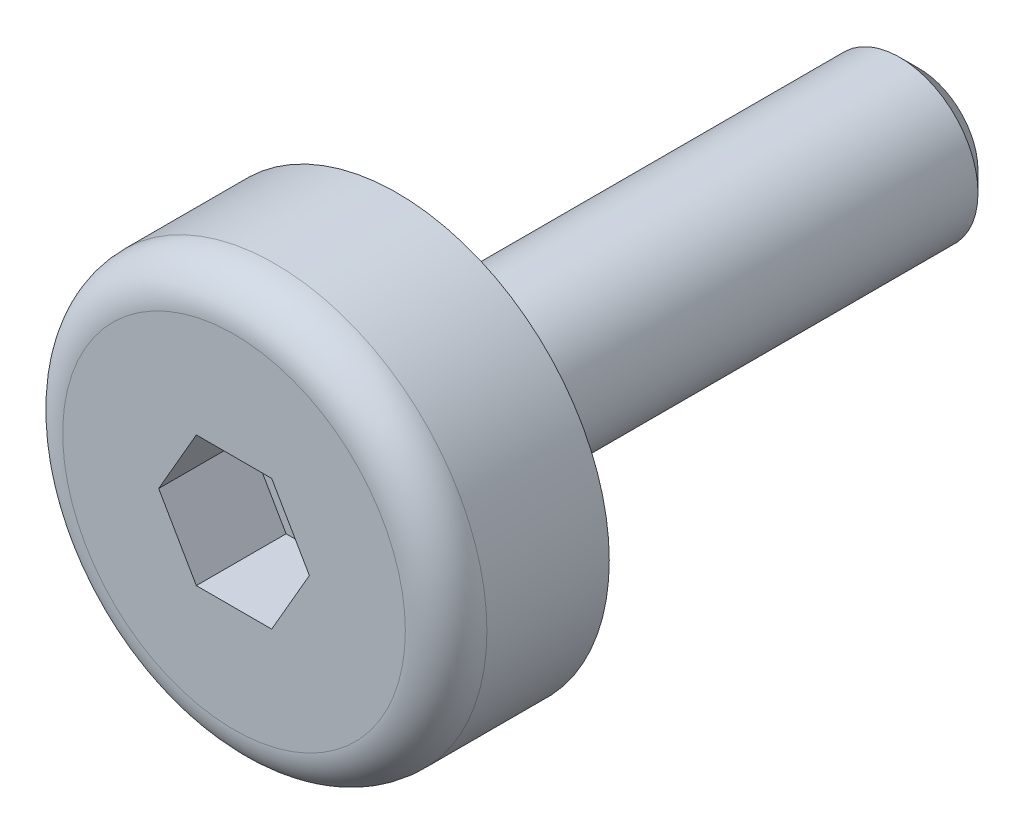
ISO-10303-21;
HEADER;
FILE_DESCRIPTION(('STEP AP214'),'2;1');
FILE_NAME('part.step','',(''),(''),'','','');
FILE_SCHEMA(('AUTOMOTIVE_DESIGN { 1 0 10303 214 1 1 1 1 }'));
ENDSEC;
DATA;
#1=APPLICATION_CONTEXT('core data for automotive mechanical design processes');
#2=APPLICATION_PROTOCOL_DEFINITION('international standard','automotive_design',2000,#1);
#3=PRODUCT_CONTEXT('',#1,'mechanical');
#4=PRODUCT('Part','Part','',(#3));
#5=PRODUCT_RELATED_PRODUCT_CATEGORY('part','',(#4));
#6=PRODUCT_DEFINITION_FORMATION('','',#4);
#7=PRODUCT_DEFINITION_CONTEXT('part definition',#1,'design');
#8=PRODUCT_DEFINITION('design','',#6,#7);
#9=PRODUCT_DEFINITION_SHAPE('','',#8);
#10=(LENGTH_UNIT() NAMED_UNIT(*) SI_UNIT(.MILLI.,.METRE.));
#11=(NAMED_UNIT(*) PLANE_ANGLE_UNIT() SI_UNIT($,.RADIAN.));
#12=(NAMED_UNIT(*) SI_UNIT($,.STERADIAN.) SOLID_ANGLE_UNIT());
#13=UNCERTAINTY_MEASURE_WITH_UNIT(LENGTH_MEASURE(1.E-05),#10,'distance_accuracy_value','');
#14=(GEOMETRIC_REPRESENTATION_CONTEXT(3) GLOBAL_UNCERTAINTY_ASSIGNED_CONTEXT((#13)) GLOBAL_UNIT_ASSIGNED_CONTEXT((#10,
#11,#12)) REPRESENTATION_CONTEXT('',''));
#15=CARTESIAN_POINT('',(0.,0.,0.));
#16=DIRECTION('',(0.,0.,1.));
#17=DIRECTION('',(1.,0.,0.));
#18=AXIS2_PLACEMENT_3D('',#15,#16,#17);
#19=CARTESIAN_POINT('',(0.,0.,-8.));
#20=DIRECTION('',(0.,0.,-1.));
#21=DIRECTION('',(-1.,0.,0.));
#22=AXIS2_PLACEMENT_3D('',#19,#20,#21);
#23=PLANE('',#22);
#24=CARTESIAN_POINT('',(0.,0.,-8.));
#25=DIRECTION('',(0.,0.,-1.));
#26=DIRECTION('',(-1.,0.,0.));
#27=AXIS2_PLACEMENT_3D('',#24,#25,#26);
#28=CIRCLE('',#27,0.899999999999995);
#29=CARTESIAN_POINT('',(0.899999999999995,0.,-8.));
#30=VERTEX_POINT('',#29);
#31=EDGE_CURVE('E156',#30,#30,#28,.T.);
#32=ORIENTED_EDGE('',*,*,#31,.T.);
#33=EDGE_LOOP('',(#32));
#34=FACE_BOUND('',#33,.T.);
#35=ADVANCED_FACE('F40',(#34),#23,.T.);
#36=CARTESIAN_POINT('',(0.,0.,10.123));
#37=DIRECTION('',(0.,0.,1.));
#38=DIRECTION('',(1.,0.,0.));
#39=AXIS2_PLACEMENT_3D('',#36,#37,#38);
#40=CYLINDRICAL_SURFACE('',#39,1.2);
#41=CARTESIAN_POINT('',(0.,0.,-7.69999999999999));
#42=DIRECTION('',(0.,0.,-1.));
#43=DIRECTION('',(-1.,0.,0.));
#44=AXIS2_PLACEMENT_3D('',#41,#42,#43);
#45=CIRCLE('',#44,1.2);
#46=CARTESIAN_POINT('',(1.2,0.,-7.69999999999999));
#47=VERTEX_POINT('',#46);
#48=EDGE_CURVE('E153',#47,#47,#45,.F.);
#49=ORIENTED_EDGE('',*,*,#48,.T.);
#50=EDGE_LOOP('',(#49));
#51=FACE_BOUND('',#50,.T.);
#52=CARTESIAN_POINT('',(0.,0.,0.));
#53=DIRECTION('',(0.,0.,1.));
#54=DIRECTION('',(1.,0.,0.));
#55=AXIS2_PLACEMENT_3D('',#52,#53,#54);
#56=CIRCLE('',#55,1.2);
#57=CARTESIAN_POINT('',(1.2,0.,0.));
#58=VERTEX_POINT('',#57);
#59=EDGE_CURVE('E150',#58,#58,#56,.T.);
#60=ORIENTED_EDGE('',*,*,#59,.F.);
#61=EDGE_LOOP('',(#60));
#62=FACE_BOUND('',#61,.T.);
#63=ADVANCED_FACE('F176',(#51,#62),#40,.T.);
#64=CARTESIAN_POINT('',(1.2,0.,0.));
#65=DIRECTION('',(0.,0.,-1.));
#66=DIRECTION('',(-1.,0.,0.));
#67=AXIS2_PLACEMENT_3D('',#64,#65,#66);
#68=PLANE('',#67);
#69=ORIENTED_EDGE('',*,*,#59,.T.);
#70=EDGE_LOOP('',(#69));
#71=FACE_BOUND('',#70,.T.);
#72=CARTESIAN_POINT('',(0.,0.,0.));
#73=DIRECTION('',(0.,0.,1.));
#74=DIRECTION('',(1.,0.,0.));
#75=AXIS2_PLACEMENT_3D('',#72,#73,#74);
#76=CIRCLE('',#75,3.25);
#77=CARTESIAN_POINT('',(3.25,0.,0.));
#78=VERTEX_POINT('',#77);
#79=EDGE_CURVE('E142',#78,#78,#76,.T.);
#80=ORIENTED_EDGE('',*,*,#79,.F.);
#81=EDGE_LOOP('',(#80));
#82=FACE_BOUND('',#81,.T.);
#83=ADVANCED_FACE('F182',(#71,#82),#68,.T.);
#84=CARTESIAN_POINT('',(0.,0.,10.123));
#85=DIRECTION('',(0.,0.,1.));
#86=DIRECTION('',(1.,0.,0.));
#87=AXIS2_PLACEMENT_3D('',#84,#85,#86);
#88=CYLINDRICAL_SURFACE('',#87,3.25);
#89=CARTESIAN_POINT('',(0.,0.,1.875));
#90=DIRECTION('',(0.,0.,1.));
#91=DIRECTION('',(1.,0.,0.));
#92=AXIS2_PLACEMENT_3D('',#89,#90,#91);
#93=CIRCLE('',#92,3.25);
#94=CARTESIAN_POINT('',(3.25,0.,1.875));
#95=VERTEX_POINT('',#94);
#96=EDGE_CURVE('E11',#95,#95,#93,.F.);
#97=ORIENTED_EDGE('',*,*,#96,.T.);
#98=EDGE_LOOP('',(#97));
#99=FACE_BOUND('',#98,.T.);
#100=ORIENTED_EDGE('',*,*,#79,.T.);
#101=EDGE_LOOP('',(#100));
#102=FACE_BOUND('',#101,.T.);
#103=ADVANCED_FACE('F191',(#99,#102),#88,.T.);
#104=CARTESIAN_POINT('',(3.25,0.,2.5));
#105=DIRECTION('',(0.,0.,1.));
#106=DIRECTION('',(1.,0.,0.));
#107=AXIS2_PLACEMENT_3D('',#104,#105,#106);
#108=PLANE('',#107);
#109=DIRECTION('',(0.499999999999995,0.866025403784441,0.));
#110=VECTOR('',#109,1.);
#111=CARTESIAN_POINT('',(0.577350269189637,-0.999999999999993,2.5));
#112=LINE('',#111,#110);
#113=CARTESIAN_POINT('',(0.577350269189637,-0.999999999999993,2.5));
#114=VERTEX_POINT('',#113);
#115=CARTESIAN_POINT('',(1.15470053837925,0.,2.5));
#116=VERTEX_POINT('',#115);
#117=EDGE_CURVE('E55',#114,#116,#112,.T.);
#118=ORIENTED_EDGE('',*,*,#117,.F.);
#119=DIRECTION('',(1.,0.,0.));
#120=VECTOR('',#119,1.);
#121=CARTESIAN_POINT('',(-0.577350269189617,-1.00000000000001,2.5));
#122=LINE('',#121,#120);
#123=CARTESIAN_POINT('',(-0.577350269189617,-1.00000000000001,2.5));
#124=VERTEX_POINT('',#123);
#125=EDGE_CURVE('E138',#124,#114,#122,.T.);
#126=ORIENTED_EDGE('',*,*,#125,.F.);
#127=DIRECTION('',(0.500000000000007,-0.866025403784434,0.));
#128=VECTOR('',#127,1.);
#129=CARTESIAN_POINT('',(-1.15470053837925,0.,2.5));
#130=LINE('',#129,#128);
#131=CARTESIAN_POINT('',(-1.15470053837925,0.,2.5));
#132=VERTEX_POINT('',#131);
#133=EDGE_CURVE('E136',#132,#124,#130,.T.);
#134=ORIENTED_EDGE('',*,*,#133,.F.);
#135=DIRECTION('',(-0.499999999999995,-0.866025403784442,0.));
#136=VECTOR('',#135,1.);
#137=CARTESIAN_POINT('',(-0.57735026918963,0.999999999999998,2.5));
#138=LINE('',#137,#136);
#139=CARTESIAN_POINT('',(-0.57735026918963,0.999999999999998,2.5));
#140=VERTEX_POINT('',#139);
#141=EDGE_CURVE('E103',#140,#132,#138,.T.);
#142=ORIENTED_EDGE('',*,*,#141,.F.);
#143=DIRECTION('',(-1.,0.,0.));
#144=VECTOR('',#143,1.);
#145=CARTESIAN_POINT('',(0.577350269189624,1.,2.5));
#146=LINE('',#145,#144);
#147=CARTESIAN_POINT('',(0.577350269189624,1.,2.5));
#148=VERTEX_POINT('',#147);
#149=EDGE_CURVE('E132',#148,#140,#146,.T.);
#150=ORIENTED_EDGE('',*,*,#149,.F.);
#151=DIRECTION('',(-0.500000000000001,0.866025403784438,0.));
#152=VECTOR('',#151,1.);
#153=CARTESIAN_POINT('',(1.15470053837925,0.,2.5));
#154=LINE('',#153,#152);
#155=EDGE_CURVE('E129',#116,#148,#154,.T.);
#156=ORIENTED_EDGE('',*,*,#155,.F.);
#157=EDGE_LOOP('',(#118,#126,#134,#142,#150,#156));
#158=FACE_BOUND('',#157,.T.);
#159=CARTESIAN_POINT('',(0.,0.,2.5));
#160=DIRECTION('',(0.,0.,1.));
#161=DIRECTION('',(1.,0.,0.));
#162=AXIS2_PLACEMENT_3D('',#159,#160,#161);
#163=CIRCLE('',#162,2.625);
#164=CARTESIAN_POINT('',(2.625,0.,2.5));
#165=VERTEX_POINT('',#164);
#166=EDGE_CURVE('E48',#165,#165,#163,.T.);
#167=ORIENTED_EDGE('',*,*,#166,.T.);
#168=EDGE_LOOP('',(#167));
#169=FACE_BOUND('',#168,.T.);
#170=ADVANCED_FACE('F161',(#158,#169),#108,.T.);
#171=CARTESIAN_POINT('',(0.,0.,-7.69999999999999));
#172=DIRECTION('',(0.,0.,1.));
#173=DIRECTION('',(1.,0.,0.));
#174=AXIS2_PLACEMENT_3D('',#171,#172,#173);
#175=CONICAL_SURFACE('',#174,1.2,0.785398163397449);
#176=CARTESIAN_POINT('',(0.899999999999995,0.,-8.));
#177=CARTESIAN_POINT('',(0.903124999999996,0.,-7.996875));
#178=CARTESIAN_POINT('',(0.906249999999996,0.,-7.99375));
#179=CARTESIAN_POINT('',(0.912499999999996,0.,-7.9875));
#180=CARTESIAN_POINT('',(0.915624999999996,0.,-7.984375));
#181=CARTESIAN_POINT('',(0.921874999999996,0.,-7.978125));
#182=CARTESIAN_POINT('',(0.924999999999996,0.,-7.975));
#183=CARTESIAN_POINT('',(0.931249999999996,0.,-7.96875));
#184=CARTESIAN_POINT('',(0.934374999999996,0.,-7.965625));
#185=CARTESIAN_POINT('',(0.940624999999996,0.,-7.959375));
#186=CARTESIAN_POINT('',(0.943749999999996,0.,-7.95625));
#187=CARTESIAN_POINT('',(0.949999999999996,0.,-7.95));
#188=CARTESIAN_POINT('',(0.953124999999996,0.,-7.946875));
#189=CARTESIAN_POINT('',(0.959374999999996,0.,-7.940625));
#190=CARTESIAN_POINT('',(0.962499999999996,0.,-7.9375));
#191=CARTESIAN_POINT('',(0.968749999999997,0.,-7.93125));
#192=CARTESIAN_POINT('',(0.971874999999997,0.,-7.928125));
#193=CARTESIAN_POINT('',(0.978124999999997,0.,-7.921875));
#194=CARTESIAN_POINT('',(0.981249999999996,0.,-7.91875));
#195=CARTESIAN_POINT('',(0.987499999999997,0.,-7.9125));
#196=CARTESIAN_POINT('',(0.990624999999997,0.,-7.909375));
#197=CARTESIAN_POINT('',(0.996874999999997,0.,-7.903125));
#198=CARTESIAN_POINT('',(0.999999999999997,0.,-7.9));
#199=CARTESIAN_POINT('',(1.00625,0.,-7.89375));
#200=CARTESIAN_POINT('',(1.009375,0.,-7.890625));
#201=CARTESIAN_POINT('',(1.015625,0.,-7.884375));
#202=CARTESIAN_POINT('',(1.01875,0.,-7.88125));
#203=CARTESIAN_POINT('',(1.025,0.,-7.875));
#204=CARTESIAN_POINT('',(1.028125,0.,-7.871875));
#205=CARTESIAN_POINT('',(1.034375,0.,-7.865625));
#206=CARTESIAN_POINT('',(1.0375,0.,-7.8625));
#207=CARTESIAN_POINT('',(1.04375,0.,-7.85625));
#208=CARTESIAN_POINT('',(1.046875,0.,-7.853125));
#209=CARTESIAN_POINT('',(1.053125,0.,-7.846875));
#210=CARTESIAN_POINT('',(1.05625,0.,-7.84375));
#211=CARTESIAN_POINT('',(1.0625,0.,-7.8375));
#212=CARTESIAN_POINT('',(1.065625,0.,-7.834375));
#213=CARTESIAN_POINT('',(1.071875,0.,-7.828125));
#214=CARTESIAN_POINT('',(1.075,0.,-7.825));
#215=CARTESIAN_POINT('',(1.08125,0.,-7.81875));
#216=CARTESIAN_POINT('',(1.084375,0.,-7.815625));
#217=CARTESIAN_POINT('',(1.090625,0.,-7.809375));
#218=CARTESIAN_POINT('',(1.09375,0.,-7.80625));
#219=CARTESIAN_POINT('',(1.1,0.,-7.8));
#220=CARTESIAN_POINT('',(1.103125,0.,-7.796875));
#221=CARTESIAN_POINT('',(1.109375,0.,-7.790625));
#222=CARTESIAN_POINT('',(1.1125,0.,-7.7875));
#223=CARTESIAN_POINT('',(1.11875,0.,-7.78125));
#224=CARTESIAN_POINT('',(1.121875,0.,-7.778125));
#225=CARTESIAN_POINT('',(1.128125,0.,-7.771875));
#226=CARTESIAN_POINT('',(1.13125,0.,-7.76875));
#227=CARTESIAN_POINT('',(1.1375,0.,-7.7625));
#228=CARTESIAN_POINT('',(1.140625,0.,-7.759375));
#229=CARTESIAN_POINT('',(1.146875,0.,-7.753125));
#230=CARTESIAN_POINT('',(1.15,0.,-7.75));
#231=CARTESIAN_POINT('',(1.15625,0.,-7.74375));
#232=CARTESIAN_POINT('',(1.159375,0.,-7.740625));
#233=CARTESIAN_POINT('',(1.165625,0.,-7.734375));
#234=CARTESIAN_POINT('',(1.16875,0.,-7.73124999999999));
#235=CARTESIAN_POINT('',(1.175,0.,-7.725));
#236=CARTESIAN_POINT('',(1.178125,0.,-7.721875));
#237=CARTESIAN_POINT('',(1.184375,0.,-7.71562499999999));
#238=CARTESIAN_POINT('',(1.1875,0.,-7.71249999999999));
#239=CARTESIAN_POINT('',(1.19375,0.,-7.70625));
#240=CARTESIAN_POINT('',(1.196875,0.,-7.70312499999999));
#241=CARTESIAN_POINT('',(1.2,0.,-7.69999999999999));
#242=B_SPLINE_CURVE_WITH_KNOTS('',3,(#176,#177,#178,#179,#180,#181,#182,#183,#184,#185,#186,
#187,#188,#189,#190,#191,#192,#193,#194,#195,#196,#197,#198,#199,#200,#201,#202,#203,#204,#205,
#206,#207,#208,#209,#210,#211,#212,#213,#214,#215,#216,#217,#218,#219,#220,#221,#222,#223,#224,
#225,#226,#227,#228,#229,#230,#231,#232,#233,#234,#235,#236,#237,#238,#239,#240,#241),
.UNSPECIFIED.,.F.,.F.,(4,2,2,2,2,2,2,2,2,2,2,2,2,2,2,2,2,2,2,2,2,2,2,2,2,2,2,2,2,2,2,2,4),(0.,
0.0132582521472471,0.0265165042944955,0.0397747564417438,0.0530330085889911,0.0662912607362394,
0.0795495128834877,0.0928077650307349,0.106066017177983,0.119324269325232,0.132582521472479,
0.145840773619727,0.159099025766976,0.172357277914223,0.185615530061471,0.198873782208719,
0.212132034355967,0.225390286503215,0.238648538650463,0.251906790797711,0.265165042944959,
0.278423295092207,0.291681547239455,0.304939799386703,0.318198051533951,0.331456303681199,
0.344714555828447,0.357972807975695,0.371231060122943,0.384489312270191,0.397747564417439,
0.411005816564686,0.424264068711934),.UNSPECIFIED.);
#243=EDGE_CURVE('BSEAM165',#30,#47,#242,.T.);
#244=ORIENTED_EDGE('',*,*,#31,.F.);
#245=ORIENTED_EDGE('',*,*,#48,.F.);
#246=ORIENTED_EDGE('',*,*,#243,.T.);
#247=ORIENTED_EDGE('',*,*,#243,.F.);
#248=EDGE_LOOP('',(#244,#246,#245,#247));
#249=FACE_BOUND('',#248,.T.);
#250=ADVANCED_FACE('F165',(#249),#175,.T.);
#251=CARTESIAN_POINT('',(0.,0.,1.875));
#252=DIRECTION('',(0.,0.,1.));
#253=DIRECTION('',(1.,0.,0.));
#254=AXIS2_PLACEMENT_3D('',#251,#252,#253);
#255=TOROIDAL_SURFACE('',#254,2.625,0.625);
#256=ORIENTED_EDGE('',*,*,#96,.F.);
#257=EDGE_LOOP('',(#256));
#258=FACE_BOUND('',#257,.T.);
#259=ORIENTED_EDGE('',*,*,#166,.F.);
#260=EDGE_LOOP('',(#259));
#261=FACE_BOUND('',#260,.T.);
#262=ADVANCED_FACE('F42',(#258,#261),#255,.T.);
#263=CARTESIAN_POINT('',(0.577350269189637,-0.999999999999993,1.125));
#264=DIRECTION('',(0.866025403784441,-0.499999999999995,0.));
#265=DIRECTION('',(0.499999999999995,0.866025403784441,0.));
#266=AXIS2_PLACEMENT_3D('',#263,#264,#265);
#267=PLANE('',#266);
#268=ORIENTED_EDGE('',*,*,#117,.T.);
#269=DIRECTION('',(0.,0.,1.));
#270=VECTOR('',#269,1.);
#271=CARTESIAN_POINT('',(1.15470053837925,0.,1.125));
#272=LINE('',#271,#270);
#273=CARTESIAN_POINT('',(1.15470053837925,0.,1.125));
#274=VERTEX_POINT('',#273);
#275=EDGE_CURVE('E85',#274,#116,#272,.T.);
#276=ORIENTED_EDGE('',*,*,#275,.F.);
#277=DIRECTION('',(0.499999999999995,0.866025403784441,0.));
#278=VECTOR('',#277,1.);
#279=CARTESIAN_POINT('',(0.577350269189637,-0.999999999999993,1.125));
#280=LINE('',#279,#278);
#281=CARTESIAN_POINT('',(0.577350269189637,-0.999999999999993,1.125));
#282=VERTEX_POINT('',#281);
#283=EDGE_CURVE('E140',#282,#274,#280,.T.);
#284=ORIENTED_EDGE('',*,*,#283,.F.);
#285=DIRECTION('',(0.,0.,1.));
#286=VECTOR('',#285,1.);
#287=CARTESIAN_POINT('',(0.577350269189637,-0.999999999999993,1.125));
#288=LINE('',#287,#286);
#289=EDGE_CURVE('E63',#282,#114,#288,.T.);
#290=ORIENTED_EDGE('',*,*,#289,.T.);
#291=EDGE_LOOP('',(#268,#276,#284,#290));
#292=FACE_BOUND('',#291,.T.);
#293=ADVANCED_FACE('F164',(#292),#267,.F.);
#294=CARTESIAN_POINT('',(-0.577350269189617,-1.00000000000001,1.125));
#295=DIRECTION('',(0.,-1.,0.));
#296=DIRECTION('',(1.,0.,0.));
#297=AXIS2_PLACEMENT_3D('',#294,#295,#296);
#298=PLANE('',#297);
#299=ORIENTED_EDGE('',*,*,#125,.T.);
#300=ORIENTED_EDGE('',*,*,#289,.F.);
#301=DIRECTION('',(1.,0.,0.));
#302=VECTOR('',#301,1.);
#303=CARTESIAN_POINT('',(-0.577350269189617,-1.00000000000001,1.125));
#304=LINE('',#303,#302);
#305=CARTESIAN_POINT('',(-0.577350269189617,-1.00000000000001,1.125));
#306=VERTEX_POINT('',#305);
#307=EDGE_CURVE('E115',#306,#282,#304,.T.);
#308=ORIENTED_EDGE('',*,*,#307,.F.);
#309=DIRECTION('',(0.,0.,1.));
#310=VECTOR('',#309,1.);
#311=CARTESIAN_POINT('',(-0.577350269189617,-1.00000000000001,1.125));
#312=LINE('',#311,#310);
#313=EDGE_CURVE('E107',#306,#124,#312,.T.);
#314=ORIENTED_EDGE('',*,*,#313,.T.);
#315=EDGE_LOOP('',(#299,#300,#308,#314));
#316=FACE_BOUND('',#315,.T.);
#317=ADVANCED_FACE('F171',(#316),#298,.F.);
#318=CARTESIAN_POINT('',(-1.15470053837925,0.,1.125));
#319=DIRECTION('',(-0.866025403784435,-0.500000000000007,0.));
#320=DIRECTION('',(0.500000000000007,-0.866025403784435,0.));
#321=AXIS2_PLACEMENT_3D('',#318,#319,#320);
#322=PLANE('',#321);
#323=ORIENTED_EDGE('',*,*,#133,.T.);
#324=ORIENTED_EDGE('',*,*,#313,.F.);
#325=DIRECTION('',(0.500000000000007,-0.866025403784434,0.));
#326=VECTOR('',#325,1.);
#327=CARTESIAN_POINT('',(-1.15470053837925,0.,1.125));
#328=LINE('',#327,#326);
#329=CARTESIAN_POINT('',(-1.15470053837925,0.,1.125));
#330=VERTEX_POINT('',#329);
#331=EDGE_CURVE('E111',#330,#306,#328,.T.);
#332=ORIENTED_EDGE('',*,*,#331,.F.);
#333=DIRECTION('',(0.,0.,1.));
#334=VECTOR('',#333,1.);
#335=CARTESIAN_POINT('',(-1.15470053837925,0.,1.125));
#336=LINE('',#335,#334);
#337=EDGE_CURVE('E96',#330,#132,#336,.T.);
#338=ORIENTED_EDGE('',*,*,#337,.T.);
#339=EDGE_LOOP('',(#323,#324,#332,#338));
#340=FACE_BOUND('',#339,.T.);
#341=ADVANCED_FACE('F112',(#340),#322,.F.);
#342=CARTESIAN_POINT('',(-0.57735026918963,0.999999999999998,1.125));
#343=DIRECTION('',(-0.866025403784442,0.499999999999995,0.));
#344=DIRECTION('',(-0.499999999999995,-0.866025403784441,0.));
#345=AXIS2_PLACEMENT_3D('',#342,#343,#344);
#346=PLANE('',#345);
#347=ORIENTED_EDGE('',*,*,#141,.T.);
#348=ORIENTED_EDGE('',*,*,#337,.F.);
#349=DIRECTION('',(-0.499999999999995,-0.866025403784442,0.));
#350=VECTOR('',#349,1.);
#351=CARTESIAN_POINT('',(-0.57735026918963,0.999999999999998,1.125));
#352=LINE('',#351,#350);
#353=CARTESIAN_POINT('',(-0.57735026918963,0.999999999999998,1.125));
#354=VERTEX_POINT('',#353);
#355=EDGE_CURVE('E100',#354,#330,#352,.T.);
#356=ORIENTED_EDGE('',*,*,#355,.F.);
#357=DIRECTION('',(0.,0.,1.));
#358=VECTOR('',#357,1.);
#359=CARTESIAN_POINT('',(-0.57735026918963,0.999999999999998,1.125));
#360=LINE('',#359,#358);
#361=EDGE_CURVE('E108',#354,#140,#360,.T.);
#362=ORIENTED_EDGE('',*,*,#361,.T.);
#363=EDGE_LOOP('',(#347,#348,#356,#362));
#364=FACE_BOUND('',#363,.T.);
#365=ADVANCED_FACE('F98',(#364),#346,.F.);
#366=CARTESIAN_POINT('',(0.577350269189624,1.,1.125));
#367=DIRECTION('',(0.,1.,0.));
#368=DIRECTION('',(-1.,0.,0.));
#369=AXIS2_PLACEMENT_3D('',#366,#367,#368);
#370=PLANE('',#369);
#371=ORIENTED_EDGE('',*,*,#149,.T.);
#372=ORIENTED_EDGE('',*,*,#361,.F.);
#373=DIRECTION('',(-1.,0.,0.));
#374=VECTOR('',#373,1.);
#375=CARTESIAN_POINT('',(0.577350269189624,1.,1.125));
#376=LINE('',#375,#374);
#377=CARTESIAN_POINT('',(0.577350269189624,1.,1.125));
#378=VERTEX_POINT('',#377);
#379=EDGE_CURVE('E121',#378,#354,#376,.T.);
#380=ORIENTED_EDGE('',*,*,#379,.F.);
#381=DIRECTION('',(0.,0.,1.));
#382=VECTOR('',#381,1.);
#383=CARTESIAN_POINT('',(0.577350269189624,1.,1.125));
#384=LINE('',#383,#382);
#385=EDGE_CURVE('E145',#378,#148,#384,.T.);
#386=ORIENTED_EDGE('',*,*,#385,.T.);
#387=EDGE_LOOP('',(#371,#372,#380,#386));
#388=FACE_BOUND('',#387,.T.);
#389=ADVANCED_FACE('F202',(#388),#370,.F.);
#390=CARTESIAN_POINT('',(1.15470053837925,0.,1.125));
#391=DIRECTION('',(0.866025403784438,0.500000000000001,0.));
#392=DIRECTION('',(-0.500000000000001,0.866025403784438,0.));
#393=AXIS2_PLACEMENT_3D('',#390,#391,#392);
#394=PLANE('',#393);
#395=ORIENTED_EDGE('',*,*,#155,.T.);
#396=ORIENTED_EDGE('',*,*,#385,.F.);
#397=DIRECTION('',(-0.500000000000001,0.866025403784438,0.));
#398=VECTOR('',#397,1.);
#399=CARTESIAN_POINT('',(1.15470053837925,0.,1.125));
#400=LINE('',#399,#398);
#401=EDGE_CURVE('E123',#274,#378,#400,.T.);
#402=ORIENTED_EDGE('',*,*,#401,.F.);
#403=ORIENTED_EDGE('',*,*,#275,.T.);
#404=EDGE_LOOP('',(#395,#396,#402,#403));
#405=FACE_BOUND('',#404,.T.);
#406=ADVANCED_FACE('F199',(#405),#394,.F.);
#407=CARTESIAN_POINT('',(0.,0.,1.125));
#408=DIRECTION('',(0.,0.,1.));
#409=DIRECTION('',(1.,0.,0.));
#410=AXIS2_PLACEMENT_3D('',#407,#408,#409);
#411=PLANE('',#410);
#412=ORIENTED_EDGE('',*,*,#283,.T.);
#413=ORIENTED_EDGE('',*,*,#401,.T.);
#414=ORIENTED_EDGE('',*,*,#379,.T.);
#415=ORIENTED_EDGE('',*,*,#355,.T.);
#416=ORIENTED_EDGE('',*,*,#331,.T.);
#417=ORIENTED_EDGE('',*,*,#307,.T.);
#418=EDGE_LOOP('',(#412,#413,#414,#415,#416,#417));
#419=FACE_BOUND('',#418,.T.);
#420=ADVANCED_FACE('F118',(#419),#411,.T.);
#421=CLOSED_SHELL('',(#35,#63,#83,#103,#170,#250,#262,#293,#317,#341,#365,#389,#406,#420));
#422=MANIFOLD_SOLID_BREP('B2',#421);
#423=ADVANCED_BREP_SHAPE_REPRESENTATION('',(#18,#422),#14);
#424=SHAPE_DEFINITION_REPRESENTATION(#9,#423);
ENDSEC;
END-ISO-10303-21;
